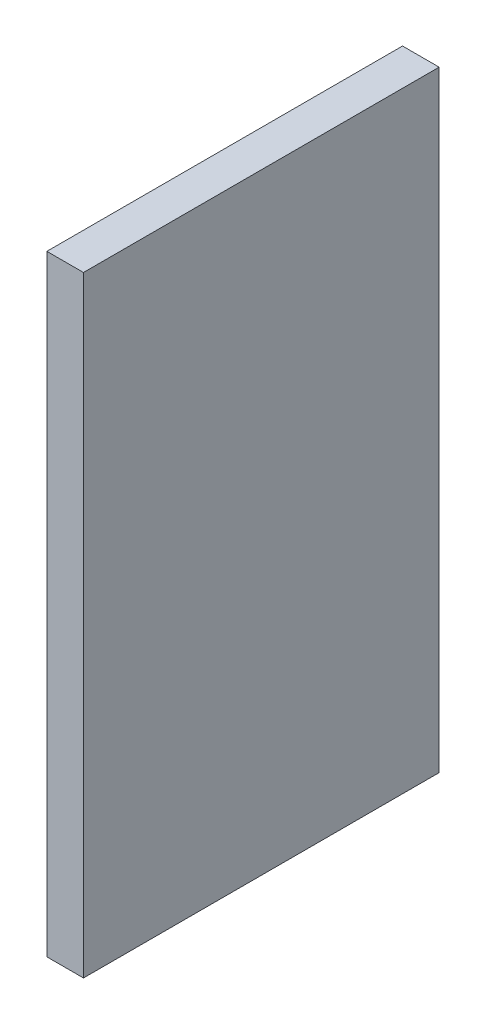
ISO-10303-21;
HEADER;
FILE_DESCRIPTION(('STEP AP214'),'2;1');
FILE_NAME('part.step','',(''),(''),'','','');
FILE_SCHEMA(('AUTOMOTIVE_DESIGN { 1 0 10303 214 1 1 1 1 }'));
ENDSEC;
DATA;
#1=APPLICATION_CONTEXT('core data for automotive mechanical design processes');
#2=APPLICATION_PROTOCOL_DEFINITION('international standard','automotive_design',2000,#1);
#3=PRODUCT_CONTEXT('',#1,'mechanical');
#4=PRODUCT('Part','Part','',(#3));
#5=PRODUCT_RELATED_PRODUCT_CATEGORY('part','',(#4));
#6=PRODUCT_DEFINITION_FORMATION('','',#4);
#7=PRODUCT_DEFINITION_CONTEXT('part definition',#1,'design');
#8=PRODUCT_DEFINITION('design','',#6,#7);
#9=PRODUCT_DEFINITION_SHAPE('','',#8);
#10=(LENGTH_UNIT() NAMED_UNIT(*) SI_UNIT(.MILLI.,.METRE.));
#11=(NAMED_UNIT(*) PLANE_ANGLE_UNIT() SI_UNIT($,.RADIAN.));
#12=(NAMED_UNIT(*) SI_UNIT($,.STERADIAN.) SOLID_ANGLE_UNIT());
#13=UNCERTAINTY_MEASURE_WITH_UNIT(LENGTH_MEASURE(1.E-05),#10,'distance_accuracy_value','');
#14=(GEOMETRIC_REPRESENTATION_CONTEXT(3) GLOBAL_UNCERTAINTY_ASSIGNED_CONTEXT((#13)) GLOBAL_UNIT_ASSIGNED_CONTEXT((#10,
#11,#12)) REPRESENTATION_CONTEXT('',''));
#15=CARTESIAN_POINT('',(0.,0.,0.));
#16=DIRECTION('',(0.,0.,1.));
#17=DIRECTION('',(1.,0.,0.));
#18=AXIS2_PLACEMENT_3D('',#15,#16,#17);
#19=CARTESIAN_POINT('',(-46.40922570889,0.,0.));
#20=DIRECTION('',(-1.,0.,0.));
#21=DIRECTION('',(0.,0.,1.));
#22=AXIS2_PLACEMENT_3D('',#19,#20,#21);
#23=PLANE('',#22);
#24=DIRECTION('',(0.,0.,-1.));
#25=VECTOR('',#24,1.);
#26=CARTESIAN_POINT('',(-46.40922570889,-11.4674355769,0.));
#27=LINE('',#26,#25);
#28=CARTESIAN_POINT('',(-46.40922570889,-11.4674355769,22.860204736935));
#29=VERTEX_POINT('',#28);
#30=CARTESIAN_POINT('',(-46.40922570889,-11.4674355769,27.813204736935));
#31=VERTEX_POINT('',#30);
#32=EDGE_CURVE('E81',#29,#31,#27,.F.);
#33=ORIENTED_EDGE('',*,*,#32,.T.);
#34=DIRECTION('',(0.,1.,0.));
#35=VECTOR('',#34,1.);
#36=CARTESIAN_POINT('',(-46.40922570889,0.,27.813204736935));
#37=LINE('',#36,#35);
#38=CARTESIAN_POINT('',(-46.40922570889,-19.9764355769,27.813204736935));
#39=VERTEX_POINT('',#38);
#40=EDGE_CURVE('E68',#31,#39,#37,.F.);
#41=ORIENTED_EDGE('',*,*,#40,.T.);
#42=DIRECTION('',(0.,0.,1.));
#43=VECTOR('',#42,1.);
#44=CARTESIAN_POINT('',(-46.40922570889,-19.9764355769,0.));
#45=LINE('',#44,#43);
#46=CARTESIAN_POINT('',(-46.40922570889,-19.9764355769,22.860204736935));
#47=VERTEX_POINT('',#46);
#48=EDGE_CURVE('E55',#39,#47,#45,.F.);
#49=ORIENTED_EDGE('',*,*,#48,.T.);
#50=DIRECTION('',(0.,1.,0.));
#51=VECTOR('',#50,1.);
#52=CARTESIAN_POINT('',(-46.40922570889,0.,22.860204736935));
#53=LINE('',#52,#51);
#54=EDGE_CURVE('E20',#47,#29,#53,.T.);
#55=ORIENTED_EDGE('',*,*,#54,.T.);
#56=EDGE_LOOP('',(#33,#41,#49,#55));
#57=FACE_BOUND('',#56,.T.);
#58=ADVANCED_FACE('F17',(#57),#23,.F.);
#59=CARTESIAN_POINT('',(-46.91922570889,0.,22.860204736935));
#60=DIRECTION('',(0.,0.,1.));
#61=DIRECTION('',(1.,0.,0.));
#62=AXIS2_PLACEMENT_3D('',#59,#60,#61);
#63=PLANE('',#62);
#64=DIRECTION('',(1.,0.,0.));
#65=VECTOR('',#64,1.);
#66=CARTESIAN_POINT('',(-46.91922570889,-19.9764355769,22.860204736935));
#67=LINE('',#66,#65);
#68=CARTESIAN_POINT('',(-46.91922570889,-19.9764355769,22.860204736935));
#69=VERTEX_POINT('',#68);
#70=EDGE_CURVE('E61',#47,#69,#67,.F.);
#71=ORIENTED_EDGE('',*,*,#70,.T.);
#72=DIRECTION('',(0.,1.,0.));
#73=VECTOR('',#72,1.);
#74=CARTESIAN_POINT('',(-46.91922570889,0.,22.860204736935));
#75=LINE('',#74,#73);
#76=CARTESIAN_POINT('',(-46.91922570889,-11.4674355769,22.860204736935));
#77=VERTEX_POINT('',#76);
#78=EDGE_CURVE('E83',#77,#69,#75,.F.);
#79=ORIENTED_EDGE('',*,*,#78,.F.);
#80=DIRECTION('',(1.,0.,0.));
#81=VECTOR('',#80,1.);
#82=CARTESIAN_POINT('',(-46.91922570889,-11.4674355769,22.860204736935));
#83=LINE('',#82,#81);
#84=EDGE_CURVE('E64',#77,#29,#83,.T.);
#85=ORIENTED_EDGE('',*,*,#84,.T.);
#86=ORIENTED_EDGE('',*,*,#54,.F.);
#87=EDGE_LOOP('',(#71,#79,#85,#86));
#88=FACE_BOUND('',#87,.T.);
#89=ADVANCED_FACE('F60',(#88),#63,.F.);
#90=CARTESIAN_POINT('',(-46.91922570889,-19.9764355769,0.));
#91=DIRECTION('',(0.,1.,0.));
#92=DIRECTION('',(0.,0.,1.));
#93=AXIS2_PLACEMENT_3D('',#90,#91,#92);
#94=PLANE('',#93);
#95=DIRECTION('',(-1.,0.,0.));
#96=VECTOR('',#95,1.);
#97=CARTESIAN_POINT('',(-46.91922570889,-19.9764355769,27.813204736935));
#98=LINE('',#97,#96);
#99=CARTESIAN_POINT('',(-46.91922570889,-19.9764355769,27.813204736935));
#100=VERTEX_POINT('',#99);
#101=EDGE_CURVE('E70',#39,#100,#98,.T.);
#102=ORIENTED_EDGE('',*,*,#101,.T.);
#103=DIRECTION('',(0.,0.,1.));
#104=VECTOR('',#103,1.);
#105=CARTESIAN_POINT('',(-46.91922570889,-19.9764355769,0.));
#106=LINE('',#105,#104);
#107=EDGE_CURVE('E74',#69,#100,#106,.T.);
#108=ORIENTED_EDGE('',*,*,#107,.F.);
#109=ORIENTED_EDGE('',*,*,#70,.F.);
#110=ORIENTED_EDGE('',*,*,#48,.F.);
#111=EDGE_LOOP('',(#102,#108,#109,#110));
#112=FACE_BOUND('',#111,.T.);
#113=ADVANCED_FACE('F72',(#112),#94,.F.);
#114=CARTESIAN_POINT('',(-46.91922570889,0.,27.813204736935));
#115=DIRECTION('',(0.,0.,-1.));
#116=DIRECTION('',(-1.,0.,0.));
#117=AXIS2_PLACEMENT_3D('',#114,#115,#116);
#118=PLANE('',#117);
#119=DIRECTION('',(1.,0.,0.));
#120=VECTOR('',#119,1.);
#121=CARTESIAN_POINT('',(-46.91922570889,-11.4674355769,27.813204736935));
#122=LINE('',#121,#120);
#123=CARTESIAN_POINT('',(-46.91922570889,-11.4674355769,27.813204736935));
#124=VERTEX_POINT('',#123);
#125=EDGE_CURVE('E35',#31,#124,#122,.F.);
#126=ORIENTED_EDGE('',*,*,#125,.T.);
#127=DIRECTION('',(0.,1.,0.));
#128=VECTOR('',#127,1.);
#129=CARTESIAN_POINT('',(-46.91922570889,0.,27.813204736935));
#130=LINE('',#129,#128);
#131=EDGE_CURVE('E26',#100,#124,#130,.T.);
#132=ORIENTED_EDGE('',*,*,#131,.F.);
#133=ORIENTED_EDGE('',*,*,#101,.F.);
#134=ORIENTED_EDGE('',*,*,#40,.F.);
#135=EDGE_LOOP('',(#126,#132,#133,#134));
#136=FACE_BOUND('',#135,.T.);
#137=ADVANCED_FACE('F89',(#136),#118,.F.);
#138=CARTESIAN_POINT('',(-46.91922570889,-11.4674355769,0.));
#139=DIRECTION('',(0.,-1.,0.));
#140=DIRECTION('',(0.,0.,-1.));
#141=AXIS2_PLACEMENT_3D('',#138,#139,#140);
#142=PLANE('',#141);
#143=ORIENTED_EDGE('',*,*,#84,.F.);
#144=DIRECTION('',(0.,0.,1.));
#145=VECTOR('',#144,1.);
#146=CARTESIAN_POINT('',(-46.91922570889,-11.4674355769,0.));
#147=LINE('',#146,#145);
#148=EDGE_CURVE('E11',#124,#77,#147,.F.);
#149=ORIENTED_EDGE('',*,*,#148,.F.);
#150=ORIENTED_EDGE('',*,*,#125,.F.);
#151=ORIENTED_EDGE('',*,*,#32,.F.);
#152=EDGE_LOOP('',(#143,#149,#150,#151));
#153=FACE_BOUND('',#152,.T.);
#154=ADVANCED_FACE('F91',(#153),#142,.F.);
#155=CARTESIAN_POINT('',(-46.91922570889,0.,0.));
#156=DIRECTION('',(-1.,0.,0.));
#157=DIRECTION('',(0.,0.,1.));
#158=AXIS2_PLACEMENT_3D('',#155,#156,#157);
#159=PLANE('',#158);
#160=ORIENTED_EDGE('',*,*,#131,.T.);
#161=ORIENTED_EDGE('',*,*,#148,.T.);
#162=ORIENTED_EDGE('',*,*,#78,.T.);
#163=ORIENTED_EDGE('',*,*,#107,.T.);
#164=EDGE_LOOP('',(#160,#161,#162,#163));
#165=FACE_BOUND('',#164,.T.);
#166=ADVANCED_FACE('F88',(#165),#159,.T.);
#167=CLOSED_SHELL('',(#58,#89,#113,#137,#154,#166));
#168=MANIFOLD_SOLID_BREP('B1',#167);
#169=ADVANCED_BREP_SHAPE_REPRESENTATION('',(#18,#168),#14);
#170=SHAPE_DEFINITION_REPRESENTATION(#9,#169);
ENDSEC;
END-ISO-10303-21;
